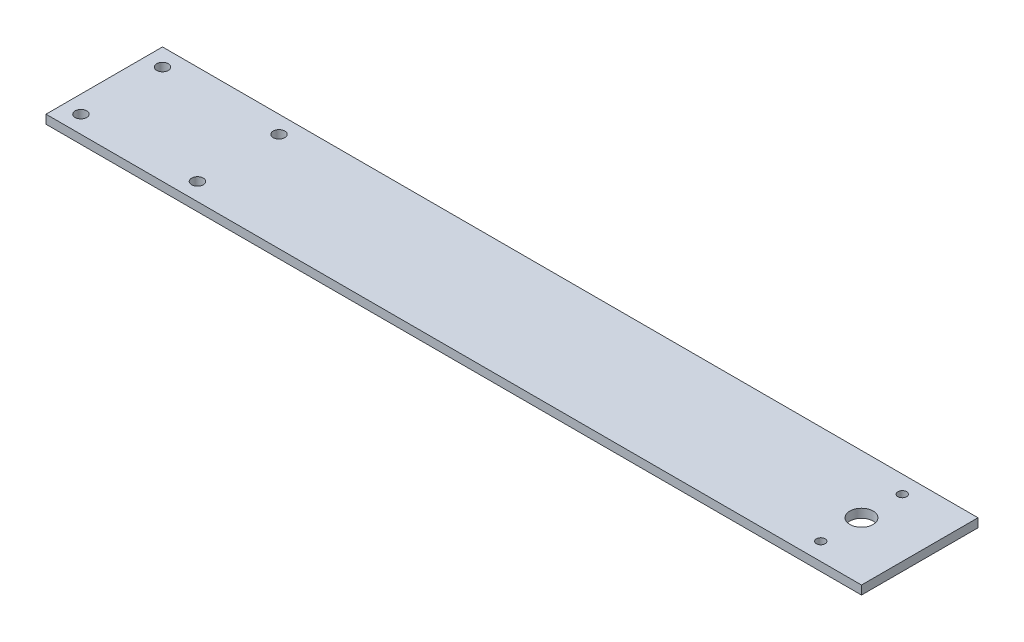
ISO-10303-21;
HEADER;
FILE_DESCRIPTION(('STEP AP214'),'2;1');
FILE_NAME('part.step','',(''),(''),'','','');
FILE_SCHEMA(('AUTOMOTIVE_DESIGN { 1 0 10303 214 1 1 1 1 }'));
ENDSEC;
DATA;
#1=APPLICATION_CONTEXT('core data for automotive mechanical design processes');
#2=APPLICATION_PROTOCOL_DEFINITION('international standard','automotive_design',2000,#1);
#3=PRODUCT_CONTEXT('',#1,'mechanical');
#4=PRODUCT('Part','Part','',(#3));
#5=PRODUCT_RELATED_PRODUCT_CATEGORY('part','',(#4));
#6=PRODUCT_DEFINITION_FORMATION('','',#4);
#7=PRODUCT_DEFINITION_CONTEXT('part definition',#1,'design');
#8=PRODUCT_DEFINITION('design','',#6,#7);
#9=PRODUCT_DEFINITION_SHAPE('','',#8);
#10=(LENGTH_UNIT() NAMED_UNIT(*) SI_UNIT(.MILLI.,.METRE.));
#11=(NAMED_UNIT(*) PLANE_ANGLE_UNIT() SI_UNIT($,.RADIAN.));
#12=(NAMED_UNIT(*) SI_UNIT($,.STERADIAN.) SOLID_ANGLE_UNIT());
#13=UNCERTAINTY_MEASURE_WITH_UNIT(LENGTH_MEASURE(1.E-05),#10,'distance_accuracy_value','');
#14=(GEOMETRIC_REPRESENTATION_CONTEXT(3) GLOBAL_UNCERTAINTY_ASSIGNED_CONTEXT((#13)) GLOBAL_UNIT_ASSIGNED_CONTEXT((#10,
#11,#12)) REPRESENTATION_CONTEXT('',''));
#15=CARTESIAN_POINT('',(0.,0.,0.));
#16=DIRECTION('',(0.,0.,1.));
#17=DIRECTION('',(1.,0.,0.));
#18=AXIS2_PLACEMENT_3D('',#15,#16,#17);
#19=CARTESIAN_POINT('',(0.,3.,0.));
#20=DIRECTION('',(0.,1.,0.));
#21=DIRECTION('',(0.,0.,1.));
#22=AXIS2_PLACEMENT_3D('',#19,#20,#21);
#23=PLANE('',#22);
#24=CARTESIAN_POINT('',(120.,3.,-14.));
#25=DIRECTION('',(0.,1.,0.));
#26=DIRECTION('',(0.,0.,1.));
#27=AXIS2_PLACEMENT_3D('',#24,#25,#26);
#28=CIRCLE('',#27,1.5);
#29=CARTESIAN_POINT('',(120.,3.,-12.5));
#30=VERTEX_POINT('',#29);
#31=EDGE_CURVE('E139',#30,#30,#28,.T.);
#32=ORIENTED_EDGE('',*,*,#31,.F.);
#33=EDGE_LOOP('',(#32));
#34=FACE_BOUND('',#33,.T.);
#35=CARTESIAN_POINT('',(-134.,3.,14.));
#36=DIRECTION('',(0.,1.,0.));
#37=DIRECTION('',(0.,0.,1.));
#38=AXIS2_PLACEMENT_3D('',#35,#36,#37);
#39=CIRCLE('',#38,2.);
#40=CARTESIAN_POINT('',(-134.,3.,16.));
#41=VERTEX_POINT('',#40);
#42=EDGE_CURVE('E127',#41,#41,#39,.T.);
#43=ORIENTED_EDGE('',*,*,#42,.F.);
#44=EDGE_LOOP('',(#43));
#45=FACE_BOUND('',#44,.T.);
#46=CARTESIAN_POINT('',(-94.,3.,-14.));
#47=DIRECTION('',(0.,1.,0.));
#48=DIRECTION('',(0.,0.,1.));
#49=AXIS2_PLACEMENT_3D('',#46,#47,#48);
#50=CIRCLE('',#49,2.);
#51=CARTESIAN_POINT('',(-94.,3.,-12.));
#52=VERTEX_POINT('',#51);
#53=EDGE_CURVE('E115',#52,#52,#50,.T.);
#54=ORIENTED_EDGE('',*,*,#53,.F.);
#55=EDGE_LOOP('',(#54));
#56=FACE_BOUND('',#55,.T.);
#57=DIRECTION('',(0.,0.,-1.));
#58=VECTOR('',#57,1.);
#59=CARTESIAN_POINT('',(140.,3.,-20.));
#60=LINE('',#59,#58);
#61=CARTESIAN_POINT('',(140.,3.,20.));
#62=VERTEX_POINT('',#61);
#63=CARTESIAN_POINT('',(140.,3.,-20.));
#64=VERTEX_POINT('',#63);
#65=EDGE_CURVE('E85',#62,#64,#60,.T.);
#66=ORIENTED_EDGE('',*,*,#65,.T.);
#67=DIRECTION('',(-1.,0.,0.));
#68=VECTOR('',#67,1.);
#69=CARTESIAN_POINT('',(-140.,3.,-20.));
#70=LINE('',#69,#68);
#71=CARTESIAN_POINT('',(-140.,3.,-20.));
#72=VERTEX_POINT('',#71);
#73=EDGE_CURVE('E80',#64,#72,#70,.T.);
#74=ORIENTED_EDGE('',*,*,#73,.T.);
#75=DIRECTION('',(0.,0.,1.));
#76=VECTOR('',#75,1.);
#77=CARTESIAN_POINT('',(-140.,3.,-20.));
#78=LINE('',#77,#76);
#79=CARTESIAN_POINT('',(-140.,3.,20.));
#80=VERTEX_POINT('',#79);
#81=EDGE_CURVE('E83',#72,#80,#78,.T.);
#82=ORIENTED_EDGE('',*,*,#81,.T.);
#83=DIRECTION('',(1.,0.,0.));
#84=VECTOR('',#83,1.);
#85=CARTESIAN_POINT('',(-140.,3.,20.));
#86=LINE('',#85,#84);
#87=EDGE_CURVE('E50',#80,#62,#86,.T.);
#88=ORIENTED_EDGE('',*,*,#87,.T.);
#89=EDGE_LOOP('',(#66,#74,#82,#88));
#90=FACE_BOUND('',#89,.T.);
#91=CARTESIAN_POINT('',(-134.,3.,-14.));
#92=DIRECTION('',(0.,1.,0.));
#93=DIRECTION('',(0.,0.,1.));
#94=AXIS2_PLACEMENT_3D('',#91,#92,#93);
#95=CIRCLE('',#94,2.);
#96=CARTESIAN_POINT('',(-134.,3.,-12.));
#97=VERTEX_POINT('',#96);
#98=EDGE_CURVE('E100',#97,#97,#95,.T.);
#99=ORIENTED_EDGE('',*,*,#98,.F.);
#100=EDGE_LOOP('',(#99));
#101=FACE_BOUND('',#100,.T.);
#102=CARTESIAN_POINT('',(-94.,3.,14.));
#103=DIRECTION('',(0.,1.,0.));
#104=DIRECTION('',(0.,0.,1.));
#105=AXIS2_PLACEMENT_3D('',#102,#103,#104);
#106=CIRCLE('',#105,2.);
#107=CARTESIAN_POINT('',(-94.,3.,16.));
#108=VERTEX_POINT('',#107);
#109=EDGE_CURVE('E121',#108,#108,#106,.T.);
#110=ORIENTED_EDGE('',*,*,#109,.F.);
#111=EDGE_LOOP('',(#110));
#112=FACE_BOUND('',#111,.T.);
#113=CARTESIAN_POINT('',(120.,3.,0.));
#114=DIRECTION('',(0.,1.,0.));
#115=DIRECTION('',(0.,0.,1.));
#116=AXIS2_PLACEMENT_3D('',#113,#114,#115);
#117=CIRCLE('',#116,3.99999999999999);
#118=CARTESIAN_POINT('',(120.,3.,3.99999999999999));
#119=VERTEX_POINT('',#118);
#120=EDGE_CURVE('E133',#119,#119,#117,.T.);
#121=ORIENTED_EDGE('',*,*,#120,.F.);
#122=EDGE_LOOP('',(#121));
#123=FACE_BOUND('',#122,.T.);
#124=CARTESIAN_POINT('',(120.,3.,14.));
#125=DIRECTION('',(0.,1.,0.));
#126=DIRECTION('',(0.,0.,1.));
#127=AXIS2_PLACEMENT_3D('',#124,#125,#126);
#128=CIRCLE('',#127,1.5);
#129=CARTESIAN_POINT('',(120.,3.,15.5));
#130=VERTEX_POINT('',#129);
#131=EDGE_CURVE('E145',#130,#130,#128,.T.);
#132=ORIENTED_EDGE('',*,*,#131,.F.);
#133=EDGE_LOOP('',(#132));
#134=FACE_BOUND('',#133,.T.);
#135=ADVANCED_FACE('F33',(#34,#45,#56,#90,#101,#112,#123,#134),#23,.T.);
#136=CARTESIAN_POINT('',(0.,0.,0.));
#137=DIRECTION('',(0.,1.,0.));
#138=DIRECTION('',(0.,0.,1.));
#139=AXIS2_PLACEMENT_3D('',#136,#137,#138);
#140=PLANE('',#139);
#141=DIRECTION('',(0.,0.,-1.));
#142=VECTOR('',#141,1.);
#143=CARTESIAN_POINT('',(140.,0.,-20.));
#144=LINE('',#143,#142);
#145=CARTESIAN_POINT('',(140.,0.,20.));
#146=VERTEX_POINT('',#145);
#147=CARTESIAN_POINT('',(140.,0.,-20.));
#148=VERTEX_POINT('',#147);
#149=EDGE_CURVE('E97',#146,#148,#144,.T.);
#150=ORIENTED_EDGE('',*,*,#149,.F.);
#151=DIRECTION('',(1.,0.,0.));
#152=VECTOR('',#151,1.);
#153=CARTESIAN_POINT('',(-140.,0.,20.));
#154=LINE('',#153,#152);
#155=CARTESIAN_POINT('',(-140.,0.,20.));
#156=VERTEX_POINT('',#155);
#157=EDGE_CURVE('E73',#156,#146,#154,.T.);
#158=ORIENTED_EDGE('',*,*,#157,.F.);
#159=DIRECTION('',(0.,0.,1.));
#160=VECTOR('',#159,1.);
#161=CARTESIAN_POINT('',(-140.,0.,-20.));
#162=LINE('',#161,#160);
#163=CARTESIAN_POINT('',(-140.,0.,-20.));
#164=VERTEX_POINT('',#163);
#165=EDGE_CURVE('E67',#164,#156,#162,.T.);
#166=ORIENTED_EDGE('',*,*,#165,.F.);
#167=DIRECTION('',(-1.,0.,0.));
#168=VECTOR('',#167,1.);
#169=CARTESIAN_POINT('',(-140.,0.,-20.));
#170=LINE('',#169,#168);
#171=EDGE_CURVE('E89',#148,#164,#170,.T.);
#172=ORIENTED_EDGE('',*,*,#171,.F.);
#173=EDGE_LOOP('',(#150,#158,#166,#172));
#174=FACE_BOUND('',#173,.T.);
#175=CARTESIAN_POINT('',(-134.,0.,-14.));
#176=DIRECTION('',(0.,1.,0.));
#177=DIRECTION('',(0.,0.,1.));
#178=AXIS2_PLACEMENT_3D('',#175,#176,#177);
#179=CIRCLE('',#178,2.);
#180=CARTESIAN_POINT('',(-134.,0.,-12.));
#181=VERTEX_POINT('',#180);
#182=EDGE_CURVE('E112',#181,#181,#179,.T.);
#183=ORIENTED_EDGE('',*,*,#182,.T.);
#184=EDGE_LOOP('',(#183));
#185=FACE_BOUND('',#184,.T.);
#186=CARTESIAN_POINT('',(-94.,0.,-14.));
#187=DIRECTION('',(0.,1.,0.));
#188=DIRECTION('',(0.,0.,1.));
#189=AXIS2_PLACEMENT_3D('',#186,#187,#188);
#190=CIRCLE('',#189,2.);
#191=CARTESIAN_POINT('',(-94.,0.,-12.));
#192=VERTEX_POINT('',#191);
#193=EDGE_CURVE('E118',#192,#192,#190,.T.);
#194=ORIENTED_EDGE('',*,*,#193,.T.);
#195=EDGE_LOOP('',(#194));
#196=FACE_BOUND('',#195,.T.);
#197=CARTESIAN_POINT('',(-94.,0.,14.));
#198=DIRECTION('',(0.,1.,0.));
#199=DIRECTION('',(0.,0.,1.));
#200=AXIS2_PLACEMENT_3D('',#197,#198,#199);
#201=CIRCLE('',#200,2.);
#202=CARTESIAN_POINT('',(-94.,0.,16.));
#203=VERTEX_POINT('',#202);
#204=EDGE_CURVE('E124',#203,#203,#201,.T.);
#205=ORIENTED_EDGE('',*,*,#204,.T.);
#206=EDGE_LOOP('',(#205));
#207=FACE_BOUND('',#206,.T.);
#208=CARTESIAN_POINT('',(-134.,0.,14.));
#209=DIRECTION('',(0.,1.,0.));
#210=DIRECTION('',(0.,0.,1.));
#211=AXIS2_PLACEMENT_3D('',#208,#209,#210);
#212=CIRCLE('',#211,2.);
#213=CARTESIAN_POINT('',(-134.,0.,16.));
#214=VERTEX_POINT('',#213);
#215=EDGE_CURVE('E130',#214,#214,#212,.T.);
#216=ORIENTED_EDGE('',*,*,#215,.T.);
#217=EDGE_LOOP('',(#216));
#218=FACE_BOUND('',#217,.T.);
#219=CARTESIAN_POINT('',(120.,0.,0.));
#220=DIRECTION('',(0.,1.,0.));
#221=DIRECTION('',(0.,0.,1.));
#222=AXIS2_PLACEMENT_3D('',#219,#220,#221);
#223=CIRCLE('',#222,3.99999999999999);
#224=CARTESIAN_POINT('',(120.,0.,3.99999999999999));
#225=VERTEX_POINT('',#224);
#226=EDGE_CURVE('E136',#225,#225,#223,.T.);
#227=ORIENTED_EDGE('',*,*,#226,.T.);
#228=EDGE_LOOP('',(#227));
#229=FACE_BOUND('',#228,.T.);
#230=CARTESIAN_POINT('',(120.,0.,-14.));
#231=DIRECTION('',(0.,1.,0.));
#232=DIRECTION('',(0.,0.,1.));
#233=AXIS2_PLACEMENT_3D('',#230,#231,#232);
#234=CIRCLE('',#233,1.5);
#235=CARTESIAN_POINT('',(120.,0.,-12.5));
#236=VERTEX_POINT('',#235);
#237=EDGE_CURVE('E142',#236,#236,#234,.T.);
#238=ORIENTED_EDGE('',*,*,#237,.T.);
#239=EDGE_LOOP('',(#238));
#240=FACE_BOUND('',#239,.T.);
#241=CARTESIAN_POINT('',(120.,0.,14.));
#242=DIRECTION('',(0.,1.,0.));
#243=DIRECTION('',(0.,0.,1.));
#244=AXIS2_PLACEMENT_3D('',#241,#242,#243);
#245=CIRCLE('',#244,1.5);
#246=CARTESIAN_POINT('',(120.,0.,15.5));
#247=VERTEX_POINT('',#246);
#248=EDGE_CURVE('E148',#247,#247,#245,.T.);
#249=ORIENTED_EDGE('',*,*,#248,.T.);
#250=EDGE_LOOP('',(#249));
#251=FACE_BOUND('',#250,.T.);
#252=ADVANCED_FACE('F108',(#174,#185,#196,#207,#218,#229,#240,#251),#140,.F.);
#253=CARTESIAN_POINT('',(140.,3.,-20.));
#254=DIRECTION('',(-1.,0.,0.));
#255=DIRECTION('',(0.,0.,1.));
#256=AXIS2_PLACEMENT_3D('',#253,#254,#255);
#257=PLANE('',#256);
#258=ORIENTED_EDGE('',*,*,#149,.T.);
#259=DIRECTION('',(0.,-1.,0.));
#260=VECTOR('',#259,1.);
#261=CARTESIAN_POINT('',(140.,3.,-20.));
#262=LINE('',#261,#260);
#263=EDGE_CURVE('E11',#64,#148,#262,.T.);
#264=ORIENTED_EDGE('',*,*,#263,.F.);
#265=ORIENTED_EDGE('',*,*,#65,.F.);
#266=DIRECTION('',(0.,-1.,0.));
#267=VECTOR('',#266,1.);
#268=CARTESIAN_POINT('',(140.,3.,20.));
#269=LINE('',#268,#267);
#270=EDGE_CURVE('E93',#62,#146,#269,.T.);
#271=ORIENTED_EDGE('',*,*,#270,.T.);
#272=EDGE_LOOP('',(#258,#264,#265,#271));
#273=FACE_BOUND('',#272,.T.);
#274=ADVANCED_FACE('F35',(#273),#257,.F.);
#275=CARTESIAN_POINT('',(-140.,3.,-20.));
#276=DIRECTION('',(0.,0.,1.));
#277=DIRECTION('',(1.,0.,0.));
#278=AXIS2_PLACEMENT_3D('',#275,#276,#277);
#279=PLANE('',#278);
#280=ORIENTED_EDGE('',*,*,#171,.T.);
#281=DIRECTION('',(0.,-1.,0.));
#282=VECTOR('',#281,1.);
#283=CARTESIAN_POINT('',(-140.,3.,-20.));
#284=LINE('',#283,#282);
#285=EDGE_CURVE('E42',#72,#164,#284,.T.);
#286=ORIENTED_EDGE('',*,*,#285,.F.);
#287=ORIENTED_EDGE('',*,*,#73,.F.);
#288=ORIENTED_EDGE('',*,*,#263,.T.);
#289=EDGE_LOOP('',(#280,#286,#287,#288));
#290=FACE_BOUND('',#289,.T.);
#291=ADVANCED_FACE('F88',(#290),#279,.F.);
#292=CARTESIAN_POINT('',(-140.,3.,-20.));
#293=DIRECTION('',(1.,0.,0.));
#294=DIRECTION('',(0.,0.,-1.));
#295=AXIS2_PLACEMENT_3D('',#292,#293,#294);
#296=PLANE('',#295);
#297=ORIENTED_EDGE('',*,*,#165,.T.);
#298=DIRECTION('',(0.,-1.,0.));
#299=VECTOR('',#298,1.);
#300=CARTESIAN_POINT('',(-140.,3.,20.));
#301=LINE('',#300,#299);
#302=EDGE_CURVE('E90',#80,#156,#301,.T.);
#303=ORIENTED_EDGE('',*,*,#302,.F.);
#304=ORIENTED_EDGE('',*,*,#81,.F.);
#305=ORIENTED_EDGE('',*,*,#285,.T.);
#306=EDGE_LOOP('',(#297,#303,#304,#305));
#307=FACE_BOUND('',#306,.T.);
#308=ADVANCED_FACE('F91',(#307),#296,.F.);
#309=CARTESIAN_POINT('',(-140.,3.,20.));
#310=DIRECTION('',(0.,0.,-1.));
#311=DIRECTION('',(-1.,0.,0.));
#312=AXIS2_PLACEMENT_3D('',#309,#310,#311);
#313=PLANE('',#312);
#314=ORIENTED_EDGE('',*,*,#157,.T.);
#315=ORIENTED_EDGE('',*,*,#270,.F.);
#316=ORIENTED_EDGE('',*,*,#87,.F.);
#317=ORIENTED_EDGE('',*,*,#302,.T.);
#318=EDGE_LOOP('',(#314,#315,#316,#317));
#319=FACE_BOUND('',#318,.T.);
#320=ADVANCED_FACE('F105',(#319),#313,.F.);
#321=CARTESIAN_POINT('',(-134.,3.,-14.));
#322=DIRECTION('',(0.,-1.,0.));
#323=DIRECTION('',(0.,0.,-1.));
#324=AXIS2_PLACEMENT_3D('',#321,#322,#323);
#325=CYLINDRICAL_SURFACE('',#324,2.);
#326=ORIENTED_EDGE('',*,*,#98,.T.);
#327=EDGE_LOOP('',(#326));
#328=FACE_BOUND('',#327,.T.);
#329=ORIENTED_EDGE('',*,*,#182,.F.);
#330=EDGE_LOOP('',(#329));
#331=FACE_BOUND('',#330,.T.);
#332=ADVANCED_FACE('F167',(#328,#331),#325,.F.);
#333=CARTESIAN_POINT('',(-94.,3.,-14.));
#334=DIRECTION('',(0.,-1.,0.));
#335=DIRECTION('',(0.,0.,-1.));
#336=AXIS2_PLACEMENT_3D('',#333,#334,#335);
#337=CYLINDRICAL_SURFACE('',#336,2.);
#338=ORIENTED_EDGE('',*,*,#53,.T.);
#339=EDGE_LOOP('',(#338));
#340=FACE_BOUND('',#339,.T.);
#341=ORIENTED_EDGE('',*,*,#193,.F.);
#342=EDGE_LOOP('',(#341));
#343=FACE_BOUND('',#342,.T.);
#344=ADVANCED_FACE('F213',(#340,#343),#337,.F.);
#345=CARTESIAN_POINT('',(-94.,3.,14.));
#346=DIRECTION('',(0.,-1.,0.));
#347=DIRECTION('',(0.,0.,-1.));
#348=AXIS2_PLACEMENT_3D('',#345,#346,#347);
#349=CYLINDRICAL_SURFACE('',#348,2.);
#350=ORIENTED_EDGE('',*,*,#109,.T.);
#351=EDGE_LOOP('',(#350));
#352=FACE_BOUND('',#351,.T.);
#353=ORIENTED_EDGE('',*,*,#204,.F.);
#354=EDGE_LOOP('',(#353));
#355=FACE_BOUND('',#354,.T.);
#356=ADVANCED_FACE('F221',(#352,#355),#349,.F.);
#357=CARTESIAN_POINT('',(-134.,3.,14.));
#358=DIRECTION('',(0.,-1.,0.));
#359=DIRECTION('',(0.,0.,-1.));
#360=AXIS2_PLACEMENT_3D('',#357,#358,#359);
#361=CYLINDRICAL_SURFACE('',#360,2.);
#362=ORIENTED_EDGE('',*,*,#42,.T.);
#363=EDGE_LOOP('',(#362));
#364=FACE_BOUND('',#363,.T.);
#365=ORIENTED_EDGE('',*,*,#215,.F.);
#366=EDGE_LOOP('',(#365));
#367=FACE_BOUND('',#366,.T.);
#368=ADVANCED_FACE('F229',(#364,#367),#361,.F.);
#369=CARTESIAN_POINT('',(120.,3.,0.));
#370=DIRECTION('',(0.,-1.,0.));
#371=DIRECTION('',(0.,0.,-1.));
#372=AXIS2_PLACEMENT_3D('',#369,#370,#371);
#373=CYLINDRICAL_SURFACE('',#372,3.99999999999999);
#374=ORIENTED_EDGE('',*,*,#120,.T.);
#375=EDGE_LOOP('',(#374));
#376=FACE_BOUND('',#375,.T.);
#377=ORIENTED_EDGE('',*,*,#226,.F.);
#378=EDGE_LOOP('',(#377));
#379=FACE_BOUND('',#378,.T.);
#380=ADVANCED_FACE('F238',(#376,#379),#373,.F.);
#381=CARTESIAN_POINT('',(120.,3.,-14.));
#382=DIRECTION('',(0.,-1.,0.));
#383=DIRECTION('',(0.,0.,-1.));
#384=AXIS2_PLACEMENT_3D('',#381,#382,#383);
#385=CYLINDRICAL_SURFACE('',#384,1.5);
#386=ORIENTED_EDGE('',*,*,#31,.T.);
#387=EDGE_LOOP('',(#386));
#388=FACE_BOUND('',#387,.T.);
#389=ORIENTED_EDGE('',*,*,#237,.F.);
#390=EDGE_LOOP('',(#389));
#391=FACE_BOUND('',#390,.T.);
#392=ADVANCED_FACE('F247',(#388,#391),#385,.F.);
#393=CARTESIAN_POINT('',(120.,3.,14.));
#394=DIRECTION('',(0.,-1.,0.));
#395=DIRECTION('',(0.,0.,-1.));
#396=AXIS2_PLACEMENT_3D('',#393,#394,#395);
#397=CYLINDRICAL_SURFACE('',#396,1.5);
#398=ORIENTED_EDGE('',*,*,#131,.T.);
#399=EDGE_LOOP('',(#398));
#400=FACE_BOUND('',#399,.T.);
#401=ORIENTED_EDGE('',*,*,#248,.F.);
#402=EDGE_LOOP('',(#401));
#403=FACE_BOUND('',#402,.T.);
#404=ADVANCED_FACE('F154',(#400,#403),#397,.F.);
#405=CLOSED_SHELL('',(#135,#252,#274,#291,#308,#320,#332,#344,#356,#368,#380,#392,#404));
#406=MANIFOLD_SOLID_BREP('B2',#405);
#407=ADVANCED_BREP_SHAPE_REPRESENTATION('',(#18,#406),#14);
#408=SHAPE_DEFINITION_REPRESENTATION(#9,#407);
ENDSEC;
END-ISO-10303-21;
